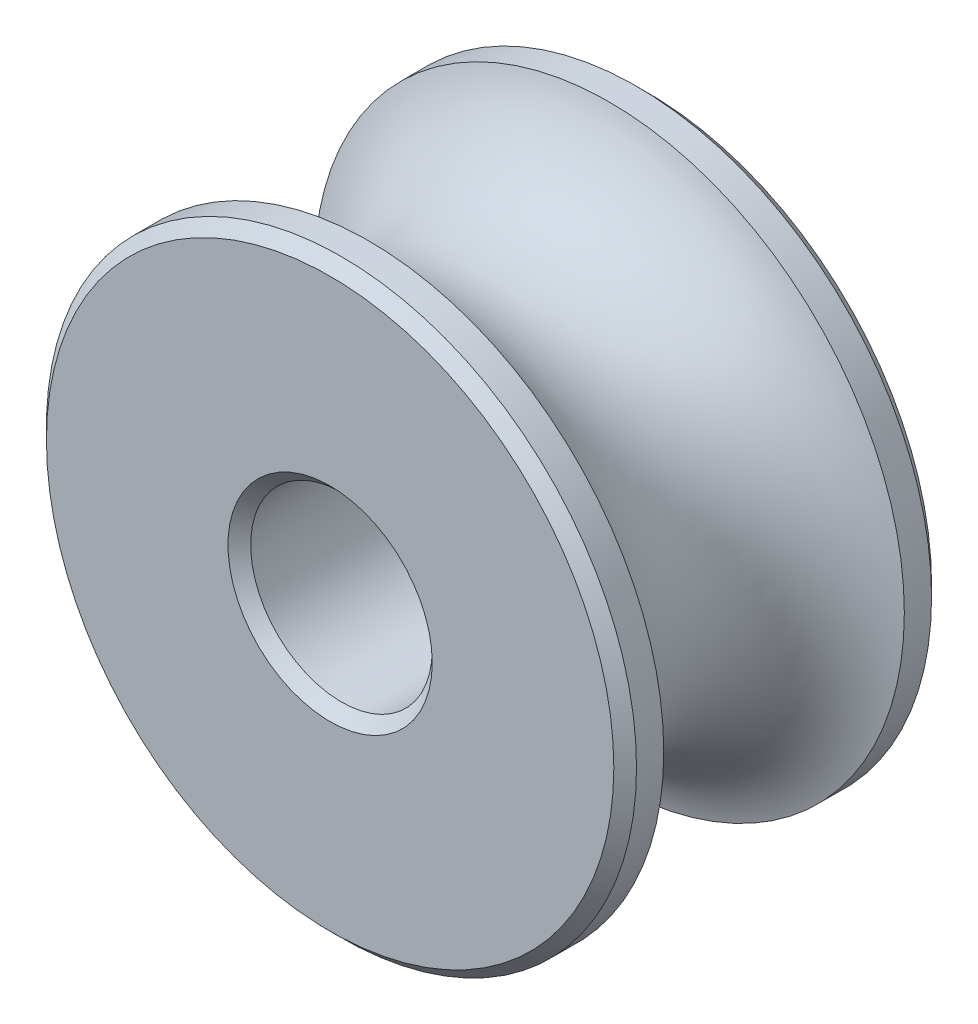
ISO-10303-21;
HEADER;
FILE_DESCRIPTION(('STEP AP214'),'2;1');
FILE_NAME('part.step','',(''),(''),'','','');
FILE_SCHEMA(('AUTOMOTIVE_DESIGN { 1 0 10303 214 1 1 1 1 }'));
ENDSEC;
DATA;
#1=APPLICATION_CONTEXT('core data for automotive mechanical design processes');
#2=APPLICATION_PROTOCOL_DEFINITION('international standard','automotive_design',2000,#1);
#3=PRODUCT_CONTEXT('',#1,'mechanical');
#4=PRODUCT('Part','Part','',(#3));
#5=PRODUCT_RELATED_PRODUCT_CATEGORY('part','',(#4));
#6=PRODUCT_DEFINITION_FORMATION('','',#4);
#7=PRODUCT_DEFINITION_CONTEXT('part definition',#1,'design');
#8=PRODUCT_DEFINITION('design','',#6,#7);
#9=PRODUCT_DEFINITION_SHAPE('','',#8);
#10=(LENGTH_UNIT() NAMED_UNIT(*) SI_UNIT(.MILLI.,.METRE.));
#11=(NAMED_UNIT(*) PLANE_ANGLE_UNIT() SI_UNIT($,.RADIAN.));
#12=(NAMED_UNIT(*) SI_UNIT($,.STERADIAN.) SOLID_ANGLE_UNIT());
#13=UNCERTAINTY_MEASURE_WITH_UNIT(LENGTH_MEASURE(1.E-05),#10,'distance_accuracy_value','');
#14=(GEOMETRIC_REPRESENTATION_CONTEXT(3) GLOBAL_UNCERTAINTY_ASSIGNED_CONTEXT((#13)) GLOBAL_UNIT_ASSIGNED_CONTEXT((#10,
#11,#12)) REPRESENTATION_CONTEXT('',''));
#15=CARTESIAN_POINT('',(0.,0.,0.));
#16=DIRECTION('',(0.,0.,1.));
#17=DIRECTION('',(1.,0.,0.));
#18=AXIS2_PLACEMENT_3D('',#15,#16,#17);
#19=CARTESIAN_POINT('',(-127.181601968341,28.5748663416804,17.46));
#20=DIRECTION('',(0.,0.,1.));
#21=DIRECTION('',(1.,0.,0.));
#22=AXIS2_PLACEMENT_3D('',#19,#20,#21);
#23=CYLINDRICAL_SURFACE('',#22,6.50000000000001);
#24=CARTESIAN_POINT('',(-127.181601968341,28.5748663416804,17.71));
#25=DIRECTION('',(0.,0.,1.));
#26=DIRECTION('',(1.,0.,0.));
#27=AXIS2_PLACEMENT_3D('',#24,#25,#26);
#28=CIRCLE('',#27,6.50000000000001);
#29=CARTESIAN_POINT('',(-120.681601968341,28.5748663416804,17.71));
#30=VERTEX_POINT('',#29);
#31=EDGE_CURVE('E86',#30,#30,#28,.T.);
#32=ORIENTED_EDGE('',*,*,#31,.T.);
#33=EDGE_LOOP('',(#32));
#34=FACE_BOUND('',#33,.T.);
#35=CARTESIAN_POINT('',(-127.181601968341,28.5748663416804,18.31));
#36=DIRECTION('',(0.,0.,1.));
#37=DIRECTION('',(1.,0.,0.));
#38=AXIS2_PLACEMENT_3D('',#35,#36,#37);
#39=CIRCLE('',#38,6.50000000000001);
#40=CARTESIAN_POINT('',(-120.681601968341,28.5748663416804,18.31));
#41=VERTEX_POINT('',#40);
#42=EDGE_CURVE('E10',#41,#41,#39,.T.);
#43=ORIENTED_EDGE('',*,*,#42,.F.);
#44=EDGE_LOOP('',(#43));
#45=FACE_BOUND('',#44,.T.);
#46=ADVANCED_FACE('F43',(#34,#45),#23,.T.);
#47=CARTESIAN_POINT('',(-127.181601968341,28.5748663416804,20.96));
#48=DIRECTION('',(0.,0.,1.));
#49=DIRECTION('',(1.,0.,0.));
#50=AXIS2_PLACEMENT_3D('',#47,#48,#49);
#51=TOROIDAL_SURFACE('',#50,7.255625,2.755625);
#52=ORIENTED_EDGE('',*,*,#42,.T.);
#53=EDGE_LOOP('',(#52));
#54=FACE_BOUND('',#53,.T.);
#55=CARTESIAN_POINT('',(-127.181601968341,28.5748663416804,23.61));
#56=DIRECTION('',(0.,0.,1.));
#57=DIRECTION('',(1.,0.,0.));
#58=AXIS2_PLACEMENT_3D('',#55,#56,#57);
#59=CIRCLE('',#58,6.50000000000001);
#60=CARTESIAN_POINT('',(-120.681601968341,28.5748663416804,23.61));
#61=VERTEX_POINT('',#60);
#62=EDGE_CURVE('E50',#61,#61,#59,.T.);
#63=ORIENTED_EDGE('',*,*,#62,.F.);
#64=EDGE_LOOP('',(#63));
#65=FACE_BOUND('',#64,.T.);
#66=ADVANCED_FACE('F105',(#54,#65),#51,.F.);
#67=CARTESIAN_POINT('',(-127.181601968341,28.5748663416804,17.46));
#68=DIRECTION('',(0.,0.,1.));
#69=DIRECTION('',(1.,0.,0.));
#70=AXIS2_PLACEMENT_3D('',#67,#68,#69);
#71=CYLINDRICAL_SURFACE('',#70,6.50000000000001);
#72=ORIENTED_EDGE('',*,*,#62,.T.);
#73=EDGE_LOOP('',(#72));
#74=FACE_BOUND('',#73,.T.);
#75=CARTESIAN_POINT('',(-127.181601968341,28.5748663416804,24.21));
#76=DIRECTION('',(0.,0.,1.));
#77=DIRECTION('',(1.,0.,0.));
#78=AXIS2_PLACEMENT_3D('',#75,#76,#77);
#79=CIRCLE('',#78,6.50000000000001);
#80=CARTESIAN_POINT('',(-120.681601968341,28.5748663416804,24.21));
#81=VERTEX_POINT('',#80);
#82=EDGE_CURVE('E55',#81,#81,#79,.T.);
#83=ORIENTED_EDGE('',*,*,#82,.F.);
#84=EDGE_LOOP('',(#83));
#85=FACE_BOUND('',#84,.T.);
#86=ADVANCED_FACE('F109',(#74,#85),#71,.T.);
#87=CARTESIAN_POINT('',(-127.181601968341,28.5748663416804,24.46));
#88=DIRECTION('',(0.,0.,-1.));
#89=DIRECTION('',(-1.,0.,0.));
#90=AXIS2_PLACEMENT_3D('',#87,#88,#89);
#91=CONICAL_SURFACE('',#90,6.25000000000001,0.785398163397442);
#92=ORIENTED_EDGE('',*,*,#82,.T.);
#93=EDGE_LOOP('',(#92));
#94=FACE_BOUND('',#93,.T.);
#95=CARTESIAN_POINT('',(-127.181601968341,28.5748663416804,24.46));
#96=DIRECTION('',(0.,0.,1.));
#97=DIRECTION('',(1.,0.,0.));
#98=AXIS2_PLACEMENT_3D('',#95,#96,#97);
#99=CIRCLE('',#98,6.25000000000001);
#100=CARTESIAN_POINT('',(-120.931601968341,28.5748663416804,24.46));
#101=VERTEX_POINT('',#100);
#102=EDGE_CURVE('E60',#101,#101,#99,.T.);
#103=ORIENTED_EDGE('',*,*,#102,.F.);
#104=EDGE_LOOP('',(#103));
#105=FACE_BOUND('',#104,.T.);
#106=ADVANCED_FACE('F113',(#94,#105),#91,.T.);
#107=CARTESIAN_POINT('',(-124.931601968341,28.5748663416804,24.46));
#108=DIRECTION('',(0.,0.,1.));
#109=DIRECTION('',(1.,0.,0.));
#110=AXIS2_PLACEMENT_3D('',#107,#108,#109);
#111=PLANE('',#110);
#112=ORIENTED_EDGE('',*,*,#102,.T.);
#113=EDGE_LOOP('',(#112));
#114=FACE_BOUND('',#113,.T.);
#115=CARTESIAN_POINT('',(-127.181601968341,28.5748663416804,24.46));
#116=DIRECTION('',(0.,0.,1.));
#117=DIRECTION('',(1.,0.,0.));
#118=AXIS2_PLACEMENT_3D('',#115,#116,#117);
#119=CIRCLE('',#118,2.25);
#120=CARTESIAN_POINT('',(-124.931601968341,28.5748663416804,24.46));
#121=VERTEX_POINT('',#120);
#122=EDGE_CURVE('E66',#121,#121,#119,.T.);
#123=ORIENTED_EDGE('',*,*,#122,.F.);
#124=EDGE_LOOP('',(#123));
#125=FACE_BOUND('',#124,.T.);
#126=ADVANCED_FACE('F119',(#114,#125),#111,.T.);
#127=CARTESIAN_POINT('',(-127.181601968341,28.5748663416804,24.21));
#128=DIRECTION('',(0.,0.,1.));
#129=DIRECTION('',(1.,0.,0.));
#130=AXIS2_PLACEMENT_3D('',#127,#128,#129);
#131=CONICAL_SURFACE('',#130,2.,0.785398163397448);
#132=ORIENTED_EDGE('',*,*,#122,.T.);
#133=EDGE_LOOP('',(#132));
#134=FACE_BOUND('',#133,.T.);
#135=CARTESIAN_POINT('',(-127.181601968341,28.5748663416804,24.21));
#136=DIRECTION('',(0.,0.,1.));
#137=DIRECTION('',(1.,0.,0.));
#138=AXIS2_PLACEMENT_3D('',#135,#136,#137);
#139=CIRCLE('',#138,2.);
#140=CARTESIAN_POINT('',(-125.181601968341,28.5748663416804,24.21));
#141=VERTEX_POINT('',#140);
#142=EDGE_CURVE('E70',#141,#141,#139,.T.);
#143=ORIENTED_EDGE('',*,*,#142,.F.);
#144=EDGE_LOOP('',(#143));
#145=FACE_BOUND('',#144,.T.);
#146=ADVANCED_FACE('F123',(#134,#145),#131,.F.);
#147=CARTESIAN_POINT('',(-127.181601968341,28.5748663416804,17.46));
#148=DIRECTION('',(0.,0.,1.));
#149=DIRECTION('',(1.,0.,0.));
#150=AXIS2_PLACEMENT_3D('',#147,#148,#149);
#151=CYLINDRICAL_SURFACE('',#150,2.);
#152=ORIENTED_EDGE('',*,*,#142,.T.);
#153=EDGE_LOOP('',(#152));
#154=FACE_BOUND('',#153,.T.);
#155=CARTESIAN_POINT('',(-127.181601968341,28.5748663416804,17.71));
#156=DIRECTION('',(0.,0.,1.));
#157=DIRECTION('',(1.,0.,0.));
#158=AXIS2_PLACEMENT_3D('',#155,#156,#157);
#159=CIRCLE('',#158,2.);
#160=CARTESIAN_POINT('',(-125.181601968341,28.5748663416804,17.71));
#161=VERTEX_POINT('',#160);
#162=EDGE_CURVE('E74',#161,#161,#159,.T.);
#163=ORIENTED_EDGE('',*,*,#162,.F.);
#164=EDGE_LOOP('',(#163));
#165=FACE_BOUND('',#164,.T.);
#166=ADVANCED_FACE('F127',(#154,#165),#151,.F.);
#167=CARTESIAN_POINT('',(-127.181601968341,28.5748663416804,17.46));
#168=DIRECTION('',(0.,0.,-1.));
#169=DIRECTION('',(-1.,0.,0.));
#170=AXIS2_PLACEMENT_3D('',#167,#168,#169);
#171=CONICAL_SURFACE('',#170,2.25,0.785398163397448);
#172=ORIENTED_EDGE('',*,*,#162,.T.);
#173=EDGE_LOOP('',(#172));
#174=FACE_BOUND('',#173,.T.);
#175=CARTESIAN_POINT('',(-127.181601968341,28.5748663416804,17.46));
#176=DIRECTION('',(0.,0.,1.));
#177=DIRECTION('',(1.,0.,0.));
#178=AXIS2_PLACEMENT_3D('',#175,#176,#177);
#179=CIRCLE('',#178,2.25);
#180=CARTESIAN_POINT('',(-124.931601968341,28.5748663416804,17.46));
#181=VERTEX_POINT('',#180);
#182=EDGE_CURVE('E78',#181,#181,#179,.T.);
#183=ORIENTED_EDGE('',*,*,#182,.F.);
#184=EDGE_LOOP('',(#183));
#185=FACE_BOUND('',#184,.T.);
#186=ADVANCED_FACE('F101',(#174,#185),#171,.F.);
#187=CARTESIAN_POINT('',(-120.931601968341,28.5748663416804,17.46));
#188=DIRECTION('',(0.,0.,-1.));
#189=DIRECTION('',(-1.,0.,0.));
#190=AXIS2_PLACEMENT_3D('',#187,#188,#189);
#191=PLANE('',#190);
#192=ORIENTED_EDGE('',*,*,#182,.T.);
#193=EDGE_LOOP('',(#192));
#194=FACE_BOUND('',#193,.T.);
#195=CARTESIAN_POINT('',(-127.181601968341,28.5748663416804,17.46));
#196=DIRECTION('',(0.,0.,1.));
#197=DIRECTION('',(1.,0.,0.));
#198=AXIS2_PLACEMENT_3D('',#195,#196,#197);
#199=CIRCLE('',#198,6.24999999999999);
#200=CARTESIAN_POINT('',(-120.931601968341,28.5748663416804,17.46));
#201=VERTEX_POINT('',#200);
#202=EDGE_CURVE('E82',#201,#201,#199,.T.);
#203=ORIENTED_EDGE('',*,*,#202,.F.);
#204=EDGE_LOOP('',(#203));
#205=FACE_BOUND('',#204,.T.);
#206=ADVANCED_FACE('F95',(#194,#205),#191,.T.);
#207=CARTESIAN_POINT('',(-127.181601968341,28.5748663416804,17.71));
#208=DIRECTION('',(0.,0.,1.));
#209=DIRECTION('',(1.,0.,0.));
#210=AXIS2_PLACEMENT_3D('',#207,#208,#209);
#211=CONICAL_SURFACE('',#210,6.50000000000001,0.785398163397469);
#212=ORIENTED_EDGE('',*,*,#202,.T.);
#213=EDGE_LOOP('',(#212));
#214=FACE_BOUND('',#213,.T.);
#215=ORIENTED_EDGE('',*,*,#31,.F.);
#216=EDGE_LOOP('',(#215));
#217=FACE_BOUND('',#216,.T.);
#218=ADVANCED_FACE('F93',(#214,#217),#211,.T.);
#219=CLOSED_SHELL('',(#46,#66,#86,#106,#126,#146,#166,#186,#206,#218));
#220=MANIFOLD_SOLID_BREP('B2',#219);
#221=ADVANCED_BREP_SHAPE_REPRESENTATION('',(#18,#220),#14);
#222=SHAPE_DEFINITION_REPRESENTATION(#9,#221);
ENDSEC;
END-ISO-10303-21;
